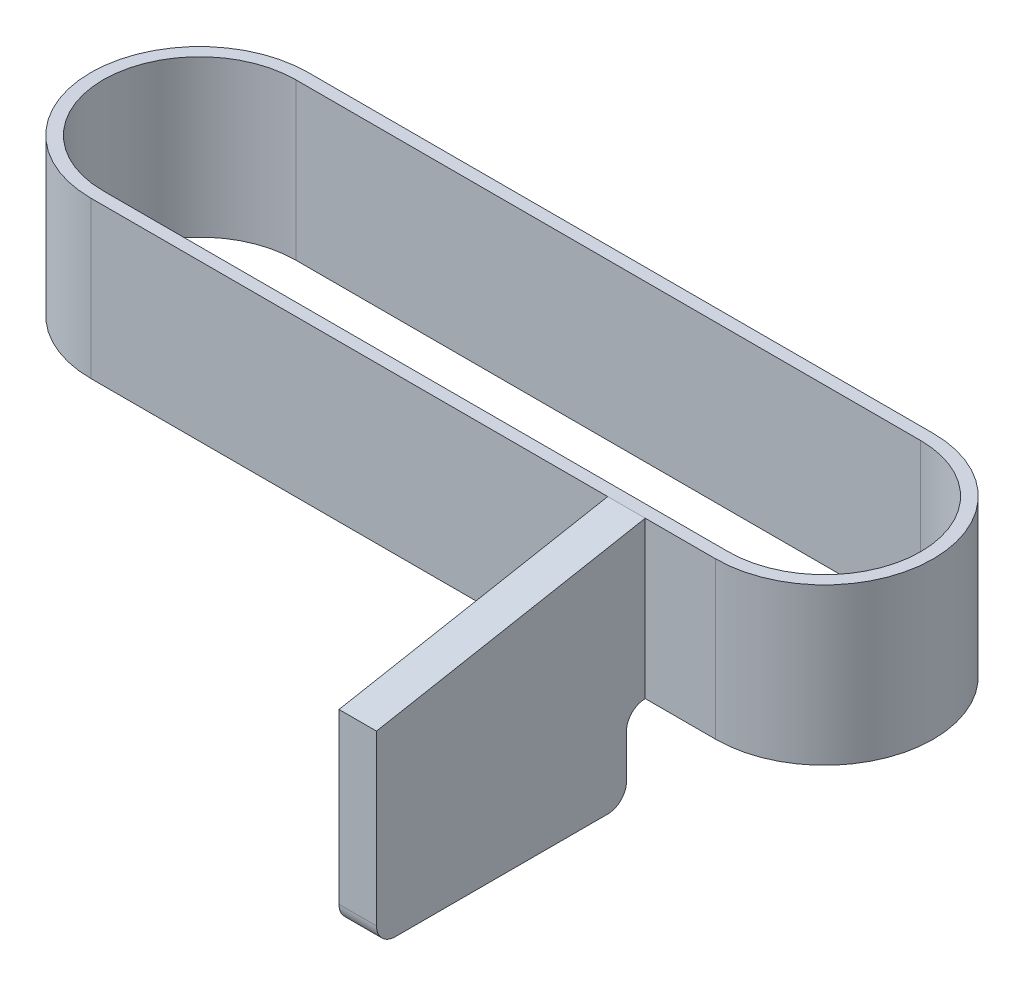
ISO-10303-21;
HEADER;
FILE_DESCRIPTION(('STEP AP214'),'2;1');
FILE_NAME('part.step','',(''),(''),'','','');
FILE_SCHEMA(('AUTOMOTIVE_DESIGN { 1 0 10303 214 1 1 1 1 }'));
ENDSEC;
DATA;
#1=APPLICATION_CONTEXT('core data for automotive mechanical design processes');
#2=APPLICATION_PROTOCOL_DEFINITION('international standard','automotive_design',2000,#1);
#3=PRODUCT_CONTEXT('',#1,'mechanical');
#4=PRODUCT('Part','Part','',(#3));
#5=PRODUCT_RELATED_PRODUCT_CATEGORY('part','',(#4));
#6=PRODUCT_DEFINITION_FORMATION('','',#4);
#7=PRODUCT_DEFINITION_CONTEXT('part definition',#1,'design');
#8=PRODUCT_DEFINITION('design','',#6,#7);
#9=PRODUCT_DEFINITION_SHAPE('','',#8);
#10=(LENGTH_UNIT() NAMED_UNIT(*) SI_UNIT(.MILLI.,.METRE.));
#11=(NAMED_UNIT(*) PLANE_ANGLE_UNIT() SI_UNIT($,.RADIAN.));
#12=(NAMED_UNIT(*) SI_UNIT($,.STERADIAN.) SOLID_ANGLE_UNIT());
#13=UNCERTAINTY_MEASURE_WITH_UNIT(LENGTH_MEASURE(1.E-05),#10,'distance_accuracy_value','');
#14=(GEOMETRIC_REPRESENTATION_CONTEXT(3) GLOBAL_UNCERTAINTY_ASSIGNED_CONTEXT((#13)) GLOBAL_UNIT_ASSIGNED_CONTEXT((#10,
#11,#12)) REPRESENTATION_CONTEXT('',''));
#15=CARTESIAN_POINT('',(0.,0.,0.));
#16=DIRECTION('',(0.,0.,1.));
#17=DIRECTION('',(1.,0.,0.));
#18=AXIS2_PLACEMENT_3D('',#15,#16,#17);
#19=CARTESIAN_POINT('',(-50.,12.5,17.4));
#20=DIRECTION('',(0.,0.,-1.));
#21=DIRECTION('',(-1.,0.,0.));
#22=AXIS2_PLACEMENT_3D('',#19,#20,#21);
#23=PLANE('',#22);
#24=DIRECTION('',(1.,0.,0.));
#25=VECTOR('',#24,1.);
#26=CARTESIAN_POINT('',(-50.,12.5,17.4));
#27=LINE('',#26,#25);
#28=CARTESIAN_POINT('',(38.717845515862,12.5,17.4));
#29=VERTEX_POINT('',#28);
#30=CARTESIAN_POINT('',(50.,12.5,17.4));
#31=VERTEX_POINT('',#30);
#32=EDGE_CURVE('E228',#29,#31,#27,.T.);
#33=ORIENTED_EDGE('',*,*,#32,.F.);
#34=DIRECTION('',(0.,-1.,0.));
#35=VECTOR('',#34,1.);
#36=CARTESIAN_POINT('',(38.717845515862,12.5,17.4));
#37=LINE('',#36,#35);
#38=CARTESIAN_POINT('',(38.717845515862,-12.5,17.4));
#39=VERTEX_POINT('',#38);
#40=EDGE_CURVE('E260',#29,#39,#37,.T.);
#41=ORIENTED_EDGE('',*,*,#40,.T.);
#42=DIRECTION('',(1.,0.,0.));
#43=VECTOR('',#42,1.);
#44=CARTESIAN_POINT('',(-50.,-12.5,17.4));
#45=LINE('',#44,#43);
#46=CARTESIAN_POINT('',(50.,-12.5,17.4));
#47=VERTEX_POINT('',#46);
#48=EDGE_CURVE('E240',#39,#47,#45,.T.);
#49=ORIENTED_EDGE('',*,*,#48,.T.);
#50=DIRECTION('',(0.,-1.,0.));
#51=VECTOR('',#50,1.);
#52=CARTESIAN_POINT('',(50.,12.5,17.4));
#53=LINE('',#52,#51);
#54=EDGE_CURVE('E252',#31,#47,#53,.T.);
#55=ORIENTED_EDGE('',*,*,#54,.F.);
#56=EDGE_LOOP('',(#33,#41,#49,#55));
#57=FACE_BOUND('',#56,.T.);
#58=ADVANCED_FACE('F41',(#57),#23,.F.);
#59=CARTESIAN_POINT('',(0.,-25.5,0.));
#60=DIRECTION('',(0.,1.,0.));
#61=DIRECTION('',(0.,0.,1.));
#62=AXIS2_PLACEMENT_3D('',#59,#60,#61);
#63=PLANE('',#62);
#64=DIRECTION('',(0.,0.,-1.));
#65=VECTOR('',#64,1.);
#66=CARTESIAN_POINT('',(38.717845515862,-25.5,60.4));
#67=LINE('',#66,#65);
#68=CARTESIAN_POINT('',(38.717845515862,-25.5,57.4));
#69=VERTEX_POINT('',#68);
#70=CARTESIAN_POINT('',(38.717845515862,-25.5,23.4));
#71=VERTEX_POINT('',#70);
#72=EDGE_CURVE('E188',#69,#71,#67,.T.);
#73=ORIENTED_EDGE('',*,*,#72,.F.);
#74=DIRECTION('',(1.,0.,0.));
#75=VECTOR('',#74,1.);
#76=CARTESIAN_POINT('',(32.7178455158621,-25.5,57.4));
#77=LINE('',#76,#75);
#78=CARTESIAN_POINT('',(32.717845515862,-25.5,57.4));
#79=VERTEX_POINT('',#78);
#80=EDGE_CURVE('E272',#69,#79,#77,.F.);
#81=ORIENTED_EDGE('',*,*,#80,.T.);
#82=DIRECTION('',(0.,0.,1.));
#83=VECTOR('',#82,1.);
#84=CARTESIAN_POINT('',(32.717845515862,-25.5,17.4));
#85=LINE('',#84,#83);
#86=CARTESIAN_POINT('',(32.717845515862,-25.5,23.4));
#87=VERTEX_POINT('',#86);
#88=EDGE_CURVE('E165',#87,#79,#85,.T.);
#89=ORIENTED_EDGE('',*,*,#88,.F.);
#90=DIRECTION('',(-1.,0.,0.));
#91=VECTOR('',#90,1.);
#92=CARTESIAN_POINT('',(38.717845515862,-25.5,23.4));
#93=LINE('',#92,#91);
#94=EDGE_CURVE('E270',#87,#71,#93,.F.);
#95=ORIENTED_EDGE('',*,*,#94,.T.);
#96=EDGE_LOOP('',(#73,#81,#89,#95));
#97=FACE_BOUND('',#96,.T.);
#98=ADVANCED_FACE('F303',(#97),#63,.F.);
#99=CARTESIAN_POINT('',(-50.,12.5,0.));
#100=DIRECTION('',(0.,1.,0.));
#101=DIRECTION('',(0.,0.,1.));
#102=AXIS2_PLACEMENT_3D('',#99,#100,#101);
#103=PLANE('',#102);
#104=CARTESIAN_POINT('',(-50.,12.5,17.4));
#105=VERTEX_POINT('',#104);
#106=CARTESIAN_POINT('',(32.717845515862,12.5,17.4));
#107=VERTEX_POINT('',#106);
#108=EDGE_CURVE('E230',#105,#107,#27,.T.);
#109=ORIENTED_EDGE('',*,*,#108,.T.);
#110=DIRECTION('',(-1.,0.,0.));
#111=VECTOR('',#110,1.);
#112=CARTESIAN_POINT('',(38.717845515862,12.5,17.4));
#113=LINE('',#112,#111);
#114=EDGE_CURVE('E175',#29,#107,#113,.T.);
#115=ORIENTED_EDGE('',*,*,#114,.F.);
#116=ORIENTED_EDGE('',*,*,#32,.T.);
#117=CARTESIAN_POINT('',(50.,12.5,0.));
#118=DIRECTION('',(0.,1.,0.));
#119=DIRECTION('',(0.,0.,1.));
#120=AXIS2_PLACEMENT_3D('',#117,#118,#119);
#121=CIRCLE('',#120,17.4);
#122=CARTESIAN_POINT('',(50.,12.5,-17.4));
#123=VERTEX_POINT('',#122);
#124=EDGE_CURVE('E233',#31,#123,#121,.T.);
#125=ORIENTED_EDGE('',*,*,#124,.T.);
#126=DIRECTION('',(-1.,0.,0.));
#127=VECTOR('',#126,1.);
#128=CARTESIAN_POINT('',(-50.,12.5,-17.4));
#129=LINE('',#128,#127);
#130=CARTESIAN_POINT('',(-50.,12.5,-17.4));
#131=VERTEX_POINT('',#130);
#132=EDGE_CURVE('E235',#123,#131,#129,.T.);
#133=ORIENTED_EDGE('',*,*,#132,.T.);
#134=CARTESIAN_POINT('',(-50.,12.5,0.));
#135=DIRECTION('',(0.,1.,0.));
#136=DIRECTION('',(0.,0.,1.));
#137=AXIS2_PLACEMENT_3D('',#134,#135,#136);
#138=CIRCLE('',#137,17.4);
#139=EDGE_CURVE('E225',#131,#105,#138,.T.);
#140=ORIENTED_EDGE('',*,*,#139,.T.);
#141=EDGE_LOOP('',(#109,#115,#116,#125,#133,#140));
#142=FACE_BOUND('',#141,.T.);
#143=DIRECTION('',(1.,0.,0.));
#144=VECTOR('',#143,1.);
#145=CARTESIAN_POINT('',(-50.,12.5,15.4));
#146=LINE('',#145,#144);
#147=CARTESIAN_POINT('',(-50.,12.5,15.4));
#148=VERTEX_POINT('',#147);
#149=CARTESIAN_POINT('',(50.,12.5,15.4));
#150=VERTEX_POINT('',#149);
#151=EDGE_CURVE('E196',#148,#150,#146,.T.);
#152=ORIENTED_EDGE('',*,*,#151,.F.);
#153=CARTESIAN_POINT('',(-50.,12.5,0.));
#154=DIRECTION('',(0.,1.,0.));
#155=DIRECTION('',(0.,0.,1.));
#156=AXIS2_PLACEMENT_3D('',#153,#154,#155);
#157=CIRCLE('',#156,15.4);
#158=CARTESIAN_POINT('',(-50.,12.5,-15.4));
#159=VERTEX_POINT('',#158);
#160=EDGE_CURVE('E194',#159,#148,#157,.T.);
#161=ORIENTED_EDGE('',*,*,#160,.F.);
#162=DIRECTION('',(-1.,0.,0.));
#163=VECTOR('',#162,1.);
#164=CARTESIAN_POINT('',(-50.,12.5,-15.4));
#165=LINE('',#164,#163);
#166=CARTESIAN_POINT('',(50.,12.5,-15.4));
#167=VERTEX_POINT('',#166);
#168=EDGE_CURVE('E202',#167,#159,#165,.T.);
#169=ORIENTED_EDGE('',*,*,#168,.F.);
#170=CARTESIAN_POINT('',(50.,12.5,0.));
#171=DIRECTION('',(0.,1.,0.));
#172=DIRECTION('',(0.,0.,1.));
#173=AXIS2_PLACEMENT_3D('',#170,#171,#172);
#174=CIRCLE('',#173,15.4);
#175=EDGE_CURVE('E199',#150,#167,#174,.T.);
#176=ORIENTED_EDGE('',*,*,#175,.F.);
#177=EDGE_LOOP('',(#152,#161,#169,#176));
#178=FACE_BOUND('',#177,.T.);
#179=ADVANCED_FACE('F325',(#142,#178),#103,.T.);
#180=CARTESIAN_POINT('',(-50.,-12.5,0.));
#181=DIRECTION('',(0.,1.,0.));
#182=DIRECTION('',(0.,0.,1.));
#183=AXIS2_PLACEMENT_3D('',#180,#181,#182);
#184=PLANE('',#183);
#185=ORIENTED_EDGE('',*,*,#48,.F.);
#186=DIRECTION('',(1.,0.,0.));
#187=VECTOR('',#186,1.);
#188=CARTESIAN_POINT('',(-50.,-12.5,17.4));
#189=LINE('',#188,#187);
#190=CARTESIAN_POINT('',(32.717845515862,-12.5,17.4));
#191=VERTEX_POINT('',#190);
#192=EDGE_CURVE('E282',#39,#191,#189,.F.);
#193=ORIENTED_EDGE('',*,*,#192,.T.);
#194=CARTESIAN_POINT('',(-50.,-12.5,17.4));
#195=VERTEX_POINT('',#194);
#196=EDGE_CURVE('E241',#195,#191,#45,.T.);
#197=ORIENTED_EDGE('',*,*,#196,.F.);
#198=CARTESIAN_POINT('',(-50.,-12.5,0.));
#199=DIRECTION('',(0.,1.,0.));
#200=DIRECTION('',(0.,0.,1.));
#201=AXIS2_PLACEMENT_3D('',#198,#199,#200);
#202=CIRCLE('',#201,17.4);
#203=CARTESIAN_POINT('',(-50.,-12.5,-17.4));
#204=VERTEX_POINT('',#203);
#205=EDGE_CURVE('E224',#204,#195,#202,.T.);
#206=ORIENTED_EDGE('',*,*,#205,.F.);
#207=DIRECTION('',(-1.,0.,0.));
#208=VECTOR('',#207,1.);
#209=CARTESIAN_POINT('',(-50.,-12.5,-17.4));
#210=LINE('',#209,#208);
#211=CARTESIAN_POINT('',(50.,-12.5,-17.4));
#212=VERTEX_POINT('',#211);
#213=EDGE_CURVE('E229',#212,#204,#210,.T.);
#214=ORIENTED_EDGE('',*,*,#213,.F.);
#215=CARTESIAN_POINT('',(50.,-12.5,0.));
#216=DIRECTION('',(0.,1.,0.));
#217=DIRECTION('',(0.,0.,1.));
#218=AXIS2_PLACEMENT_3D('',#215,#216,#217);
#219=CIRCLE('',#218,17.4);
#220=EDGE_CURVE('E244',#47,#212,#219,.T.);
#221=ORIENTED_EDGE('',*,*,#220,.F.);
#222=EDGE_LOOP('',(#185,#193,#197,#206,#214,#221));
#223=FACE_BOUND('',#222,.T.);
#224=CARTESIAN_POINT('',(-50.,-12.5,0.));
#225=DIRECTION('',(0.,1.,0.));
#226=DIRECTION('',(0.,0.,1.));
#227=AXIS2_PLACEMENT_3D('',#224,#225,#226);
#228=CIRCLE('',#227,15.4);
#229=CARTESIAN_POINT('',(-50.,-12.5,-15.4));
#230=VERTEX_POINT('',#229);
#231=CARTESIAN_POINT('',(-50.,-12.5,15.4));
#232=VERTEX_POINT('',#231);
#233=EDGE_CURVE('E192',#230,#232,#228,.T.);
#234=ORIENTED_EDGE('',*,*,#233,.T.);
#235=DIRECTION('',(1.,0.,0.));
#236=VECTOR('',#235,1.);
#237=CARTESIAN_POINT('',(-50.,-12.5,15.4));
#238=LINE('',#237,#236);
#239=CARTESIAN_POINT('',(50.,-12.5,15.4));
#240=VERTEX_POINT('',#239);
#241=EDGE_CURVE('E207',#232,#240,#238,.T.);
#242=ORIENTED_EDGE('',*,*,#241,.T.);
#243=CARTESIAN_POINT('',(50.,-12.5,0.));
#244=DIRECTION('',(0.,1.,0.));
#245=DIRECTION('',(0.,0.,1.));
#246=AXIS2_PLACEMENT_3D('',#243,#244,#245);
#247=CIRCLE('',#246,15.4);
#248=CARTESIAN_POINT('',(50.,-12.5,-15.4));
#249=VERTEX_POINT('',#248);
#250=EDGE_CURVE('E210',#240,#249,#247,.T.);
#251=ORIENTED_EDGE('',*,*,#250,.T.);
#252=DIRECTION('',(-1.,0.,0.));
#253=VECTOR('',#252,1.);
#254=CARTESIAN_POINT('',(-50.,-12.5,-15.4));
#255=LINE('',#254,#253);
#256=EDGE_CURVE('E197',#249,#230,#255,.T.);
#257=ORIENTED_EDGE('',*,*,#256,.T.);
#258=EDGE_LOOP('',(#234,#242,#251,#257));
#259=FACE_BOUND('',#258,.T.);
#260=ADVANCED_FACE('F292',(#223,#259),#184,.F.);
#261=CARTESIAN_POINT('',(-50.,12.5,0.));
#262=DIRECTION('',(0.,-1.,0.));
#263=DIRECTION('',(0.,0.,-1.));
#264=AXIS2_PLACEMENT_3D('',#261,#262,#263);
#265=CYLINDRICAL_SURFACE('',#264,17.4);
#266=ORIENTED_EDGE('',*,*,#205,.T.);
#267=DIRECTION('',(0.,-1.,0.));
#268=VECTOR('',#267,1.);
#269=CARTESIAN_POINT('',(-50.,12.5,17.4));
#270=LINE('',#269,#268);
#271=EDGE_CURVE('E255',#105,#195,#270,.T.);
#272=ORIENTED_EDGE('',*,*,#271,.F.);
#273=ORIENTED_EDGE('',*,*,#139,.F.);
#274=DIRECTION('',(0.,-1.,0.));
#275=VECTOR('',#274,1.);
#276=CARTESIAN_POINT('',(-50.,12.5,-17.4));
#277=LINE('',#276,#275);
#278=EDGE_CURVE('E237',#131,#204,#277,.T.);
#279=ORIENTED_EDGE('',*,*,#278,.T.);
#280=EDGE_LOOP('',(#266,#272,#273,#279));
#281=FACE_BOUND('',#280,.T.);
#282=ADVANCED_FACE('F330',(#281),#265,.T.);
#283=DIRECTION('',(0.,1.,0.));
#284=VECTOR('',#283,1.);
#285=CARTESIAN_POINT('',(32.717845515862,12.5,17.4));
#286=LINE('',#285,#284);
#287=EDGE_CURVE('E258',#191,#107,#286,.T.);
#288=ORIENTED_EDGE('',*,*,#287,.T.);
#289=ORIENTED_EDGE('',*,*,#108,.F.);
#290=ORIENTED_EDGE('',*,*,#271,.T.);
#291=ORIENTED_EDGE('',*,*,#196,.T.);
#292=EDGE_LOOP('',(#288,#289,#290,#291));
#293=FACE_BOUND('',#292,.T.);
#294=ADVANCED_FACE('F320',(#293),#23,.F.);
#295=CARTESIAN_POINT('',(50.,12.5,0.));
#296=DIRECTION('',(0.,-1.,0.));
#297=DIRECTION('',(0.,0.,-1.));
#298=AXIS2_PLACEMENT_3D('',#295,#296,#297);
#299=CYLINDRICAL_SURFACE('',#298,17.4);
#300=ORIENTED_EDGE('',*,*,#220,.T.);
#301=DIRECTION('',(0.,-1.,0.));
#302=VECTOR('',#301,1.);
#303=CARTESIAN_POINT('',(50.,12.5,-17.4));
#304=LINE('',#303,#302);
#305=EDGE_CURVE('E249',#123,#212,#304,.T.);
#306=ORIENTED_EDGE('',*,*,#305,.F.);
#307=ORIENTED_EDGE('',*,*,#124,.F.);
#308=ORIENTED_EDGE('',*,*,#54,.T.);
#309=EDGE_LOOP('',(#300,#306,#307,#308));
#310=FACE_BOUND('',#309,.T.);
#311=ADVANCED_FACE('F329',(#310),#299,.T.);
#312=CARTESIAN_POINT('',(-50.,12.5,-17.4));
#313=DIRECTION('',(0.,0.,1.));
#314=DIRECTION('',(1.,0.,0.));
#315=AXIS2_PLACEMENT_3D('',#312,#313,#314);
#316=PLANE('',#315);
#317=ORIENTED_EDGE('',*,*,#213,.T.);
#318=ORIENTED_EDGE('',*,*,#278,.F.);
#319=ORIENTED_EDGE('',*,*,#132,.F.);
#320=ORIENTED_EDGE('',*,*,#305,.T.);
#321=EDGE_LOOP('',(#317,#318,#319,#320));
#322=FACE_BOUND('',#321,.T.);
#323=ADVANCED_FACE('F336',(#322),#316,.F.);
#324=CARTESIAN_POINT('',(-50.,12.5,0.));
#325=DIRECTION('',(0.,-1.,0.));
#326=DIRECTION('',(0.,0.,-1.));
#327=AXIS2_PLACEMENT_3D('',#324,#325,#326);
#328=CYLINDRICAL_SURFACE('',#327,15.4);
#329=ORIENTED_EDGE('',*,*,#233,.F.);
#330=DIRECTION('',(0.,-1.,0.));
#331=VECTOR('',#330,1.);
#332=CARTESIAN_POINT('',(-50.,12.5,-15.4));
#333=LINE('',#332,#331);
#334=EDGE_CURVE('E204',#159,#230,#333,.T.);
#335=ORIENTED_EDGE('',*,*,#334,.F.);
#336=ORIENTED_EDGE('',*,*,#160,.T.);
#337=DIRECTION('',(0.,-1.,0.));
#338=VECTOR('',#337,1.);
#339=CARTESIAN_POINT('',(-50.,12.5,15.4));
#340=LINE('',#339,#338);
#341=EDGE_CURVE('E221',#148,#232,#340,.T.);
#342=ORIENTED_EDGE('',*,*,#341,.T.);
#343=EDGE_LOOP('',(#329,#335,#336,#342));
#344=FACE_BOUND('',#343,.T.);
#345=ADVANCED_FACE('F351',(#344),#328,.F.);
#346=CARTESIAN_POINT('',(-50.,12.5,15.4));
#347=DIRECTION('',(0.,0.,-1.));
#348=DIRECTION('',(-1.,0.,0.));
#349=AXIS2_PLACEMENT_3D('',#346,#347,#348);
#350=PLANE('',#349);
#351=ORIENTED_EDGE('',*,*,#241,.F.);
#352=ORIENTED_EDGE('',*,*,#341,.F.);
#353=ORIENTED_EDGE('',*,*,#151,.T.);
#354=DIRECTION('',(0.,-1.,0.));
#355=VECTOR('',#354,1.);
#356=CARTESIAN_POINT('',(50.,12.5,15.4));
#357=LINE('',#356,#355);
#358=EDGE_CURVE('E219',#150,#240,#357,.T.);
#359=ORIENTED_EDGE('',*,*,#358,.T.);
#360=EDGE_LOOP('',(#351,#352,#353,#359));
#361=FACE_BOUND('',#360,.T.);
#362=ADVANCED_FACE('F356',(#361),#350,.T.);
#363=CARTESIAN_POINT('',(50.,12.5,0.));
#364=DIRECTION('',(0.,-1.,0.));
#365=DIRECTION('',(0.,0.,-1.));
#366=AXIS2_PLACEMENT_3D('',#363,#364,#365);
#367=CYLINDRICAL_SURFACE('',#366,15.4);
#368=ORIENTED_EDGE('',*,*,#250,.F.);
#369=ORIENTED_EDGE('',*,*,#358,.F.);
#370=ORIENTED_EDGE('',*,*,#175,.T.);
#371=DIRECTION('',(0.,-1.,0.));
#372=VECTOR('',#371,1.);
#373=CARTESIAN_POINT('',(50.,12.5,-15.4));
#374=LINE('',#373,#372);
#375=EDGE_CURVE('E217',#167,#249,#374,.T.);
#376=ORIENTED_EDGE('',*,*,#375,.T.);
#377=EDGE_LOOP('',(#368,#369,#370,#376));
#378=FACE_BOUND('',#377,.T.);
#379=ADVANCED_FACE('F365',(#378),#367,.F.);
#380=CARTESIAN_POINT('',(-50.,12.5,-15.4));
#381=DIRECTION('',(0.,0.,1.));
#382=DIRECTION('',(1.,0.,0.));
#383=AXIS2_PLACEMENT_3D('',#380,#381,#382);
#384=PLANE('',#383);
#385=ORIENTED_EDGE('',*,*,#256,.F.);
#386=ORIENTED_EDGE('',*,*,#375,.F.);
#387=ORIENTED_EDGE('',*,*,#168,.T.);
#388=ORIENTED_EDGE('',*,*,#334,.T.);
#389=EDGE_LOOP('',(#385,#386,#387,#388));
#390=FACE_BOUND('',#389,.T.);
#391=ADVANCED_FACE('F369',(#390),#384,.T.);
#392=CARTESIAN_POINT('',(38.717845515862,-25.5,60.4));
#393=DIRECTION('',(1.,0.,0.));
#394=DIRECTION('',(0.,0.,-1.));
#395=AXIS2_PLACEMENT_3D('',#392,#393,#394);
#396=PLANE('',#395);
#397=DIRECTION('',(0.,1.,0.));
#398=VECTOR('',#397,1.);
#399=CARTESIAN_POINT('',(38.717845515862,-25.5,60.4));
#400=LINE('',#399,#398);
#401=CARTESIAN_POINT('',(38.717845515862,-22.5,60.4));
#402=VERTEX_POINT('',#401);
#403=CARTESIAN_POINT('',(38.717845515862,4.5,60.4));
#404=VERTEX_POINT('',#403);
#405=EDGE_CURVE('E164',#402,#404,#400,.T.);
#406=ORIENTED_EDGE('',*,*,#405,.F.);
#407=CARTESIAN_POINT('',(38.717845515862,-22.5,57.4));
#408=DIRECTION('',(1.,0.,0.));
#409=DIRECTION('',(0.,0.,-1.));
#410=AXIS2_PLACEMENT_3D('',#407,#408,#409);
#411=CIRCLE('',#410,3.);
#412=EDGE_CURVE('E268',#402,#69,#411,.T.);
#413=ORIENTED_EDGE('',*,*,#412,.T.);
#414=ORIENTED_EDGE('',*,*,#72,.T.);
#415=CARTESIAN_POINT('',(38.717845515862,-22.5,23.4));
#416=DIRECTION('',(1.,0.,0.));
#417=DIRECTION('',(0.,0.,-1.));
#418=AXIS2_PLACEMENT_3D('',#415,#416,#417);
#419=CIRCLE('',#418,3.);
#420=CARTESIAN_POINT('',(38.717845515862,-22.5,20.4));
#421=VERTEX_POINT('',#420);
#422=EDGE_CURVE('E265',#71,#421,#419,.T.);
#423=ORIENTED_EDGE('',*,*,#422,.T.);
#424=DIRECTION('',(0.,-1.,0.));
#425=VECTOR('',#424,1.);
#426=CARTESIAN_POINT('',(38.717845515862,-12.5,20.4));
#427=LINE('',#426,#425);
#428=CARTESIAN_POINT('',(38.717845515862,-15.5,20.4));
#429=VERTEX_POINT('',#428);
#430=EDGE_CURVE('E174',#429,#421,#427,.T.);
#431=ORIENTED_EDGE('',*,*,#430,.F.);
#432=CARTESIAN_POINT('',(38.717845515862,-15.5,17.4));
#433=DIRECTION('',(1.,0.,0.));
#434=DIRECTION('',(0.,0.,-1.));
#435=AXIS2_PLACEMENT_3D('',#432,#433,#434);
#436=CIRCLE('',#435,3.);
#437=EDGE_CURVE('E49',#429,#39,#436,.F.);
#438=ORIENTED_EDGE('',*,*,#437,.T.);
#439=ORIENTED_EDGE('',*,*,#40,.F.);
#440=DIRECTION('',(0.,0.182907916182992,-0.983130049483585));
#441=VECTOR('',#440,1.);
#442=CARTESIAN_POINT('',(38.717845515862,4.5,60.4));
#443=LINE('',#442,#441);
#444=EDGE_CURVE('E180',#404,#29,#443,.T.);
#445=ORIENTED_EDGE('',*,*,#444,.F.);
#446=EDGE_LOOP('',(#406,#413,#414,#423,#431,#438,#439,#445));
#447=FACE_BOUND('',#446,.T.);
#448=ADVANCED_FACE('F285',(#447),#396,.T.);
#449=CARTESIAN_POINT('',(32.717845515862,-25.5,60.4));
#450=DIRECTION('',(0.,0.,1.));
#451=DIRECTION('',(1.,0.,0.));
#452=AXIS2_PLACEMENT_3D('',#449,#450,#451);
#453=PLANE('',#452);
#454=DIRECTION('',(0.,1.,0.));
#455=VECTOR('',#454,1.);
#456=CARTESIAN_POINT('',(32.717845515862,-25.5,60.4));
#457=LINE('',#456,#455);
#458=CARTESIAN_POINT('',(32.717845515862,-22.5,60.4));
#459=VERTEX_POINT('',#458);
#460=CARTESIAN_POINT('',(32.717845515862,4.5,60.4));
#461=VERTEX_POINT('',#460);
#462=EDGE_CURVE('E153',#459,#461,#457,.T.);
#463=ORIENTED_EDGE('',*,*,#462,.F.);
#464=DIRECTION('',(1.,0.,0.));
#465=VECTOR('',#464,1.);
#466=CARTESIAN_POINT('',(38.717845515862,-22.5,60.4));
#467=LINE('',#466,#465);
#468=EDGE_CURVE('E263',#459,#402,#467,.T.);
#469=ORIENTED_EDGE('',*,*,#468,.T.);
#470=ORIENTED_EDGE('',*,*,#405,.T.);
#471=DIRECTION('',(1.,0.,0.));
#472=VECTOR('',#471,1.);
#473=CARTESIAN_POINT('',(38.717845515862,4.5,60.4));
#474=LINE('',#473,#472);
#475=EDGE_CURVE('E168',#461,#404,#474,.T.);
#476=ORIENTED_EDGE('',*,*,#475,.F.);
#477=EDGE_LOOP('',(#463,#469,#470,#476));
#478=FACE_BOUND('',#477,.T.);
#479=ADVANCED_FACE('F169',(#478),#453,.T.);
#480=CARTESIAN_POINT('',(32.717845515862,-25.5,17.4));
#481=DIRECTION('',(-1.,0.,0.));
#482=DIRECTION('',(0.,0.,1.));
#483=AXIS2_PLACEMENT_3D('',#480,#481,#482);
#484=PLANE('',#483);
#485=ORIENTED_EDGE('',*,*,#88,.T.);
#486=CARTESIAN_POINT('',(32.717845515862,-22.5,57.4));
#487=DIRECTION('',(-1.,0.,0.));
#488=DIRECTION('',(0.,0.,1.));
#489=AXIS2_PLACEMENT_3D('',#486,#487,#488);
#490=CIRCLE('',#489,3.);
#491=EDGE_CURVE('E160',#79,#459,#490,.T.);
#492=ORIENTED_EDGE('',*,*,#491,.T.);
#493=ORIENTED_EDGE('',*,*,#462,.T.);
#494=DIRECTION('',(0.,0.182907916182992,-0.983130049483585));
#495=VECTOR('',#494,1.);
#496=CARTESIAN_POINT('',(32.717845515862,4.5,60.4));
#497=LINE('',#496,#495);
#498=EDGE_CURVE('E158',#461,#107,#497,.T.);
#499=ORIENTED_EDGE('',*,*,#498,.T.);
#500=ORIENTED_EDGE('',*,*,#287,.F.);
#501=CARTESIAN_POINT('',(32.717845515862,-15.5,17.4));
#502=DIRECTION('',(-1.,0.,0.));
#503=DIRECTION('',(0.,0.,1.));
#504=AXIS2_PLACEMENT_3D('',#501,#502,#503);
#505=CIRCLE('',#504,3.);
#506=CARTESIAN_POINT('',(32.717845515862,-15.5,20.4));
#507=VERTEX_POINT('',#506);
#508=EDGE_CURVE('E11',#191,#507,#505,.F.);
#509=ORIENTED_EDGE('',*,*,#508,.T.);
#510=DIRECTION('',(0.,1.,0.));
#511=VECTOR('',#510,1.);
#512=CARTESIAN_POINT('',(32.717845515862,-12.5,20.4));
#513=LINE('',#512,#511);
#514=CARTESIAN_POINT('',(32.717845515862,-22.5,20.4));
#515=VERTEX_POINT('',#514);
#516=EDGE_CURVE('E186',#515,#507,#513,.T.);
#517=ORIENTED_EDGE('',*,*,#516,.F.);
#518=CARTESIAN_POINT('',(32.717845515862,-22.5,23.4));
#519=DIRECTION('',(-1.,0.,0.));
#520=DIRECTION('',(0.,0.,1.));
#521=AXIS2_PLACEMENT_3D('',#518,#519,#520);
#522=CIRCLE('',#521,3.);
#523=EDGE_CURVE('E274',#515,#87,#522,.T.);
#524=ORIENTED_EDGE('',*,*,#523,.T.);
#525=EDGE_LOOP('',(#485,#492,#493,#499,#500,#509,#517,#524));
#526=FACE_BOUND('',#525,.T.);
#527=ADVANCED_FACE('F156',(#526),#484,.T.);
#528=CARTESIAN_POINT('',(0.,0.,20.4));
#529=DIRECTION('',(0.,0.,-1.));
#530=DIRECTION('',(-1.,0.,0.));
#531=AXIS2_PLACEMENT_3D('',#528,#529,#530);
#532=PLANE('',#531);
#533=ORIENTED_EDGE('',*,*,#516,.T.);
#534=DIRECTION('',(1.,0.,0.));
#535=VECTOR('',#534,1.);
#536=CARTESIAN_POINT('',(0.,-15.5,20.4));
#537=LINE('',#536,#535);
#538=EDGE_CURVE('E280',#507,#429,#537,.T.);
#539=ORIENTED_EDGE('',*,*,#538,.T.);
#540=ORIENTED_EDGE('',*,*,#430,.T.);
#541=DIRECTION('',(-1.,0.,0.));
#542=VECTOR('',#541,1.);
#543=CARTESIAN_POINT('',(32.717845515862,-22.5,20.4));
#544=LINE('',#543,#542);
#545=EDGE_CURVE('E277',#421,#515,#544,.T.);
#546=ORIENTED_EDGE('',*,*,#545,.T.);
#547=EDGE_LOOP('',(#533,#539,#540,#546));
#548=FACE_BOUND('',#547,.T.);
#549=ADVANCED_FACE('F296',(#548),#532,.T.);
#550=CARTESIAN_POINT('',(38.717845515862,4.5,60.4));
#551=DIRECTION('',(0.,0.983130049483584,0.182907916182992));
#552=DIRECTION('',(0.,-0.182907916182992,0.983130049483585));
#553=AXIS2_PLACEMENT_3D('',#550,#551,#552);
#554=PLANE('',#553);
#555=ORIENTED_EDGE('',*,*,#498,.F.);
#556=ORIENTED_EDGE('',*,*,#475,.T.);
#557=ORIENTED_EDGE('',*,*,#444,.T.);
#558=ORIENTED_EDGE('',*,*,#114,.T.);
#559=EDGE_LOOP('',(#555,#556,#557,#558));
#560=FACE_BOUND('',#559,.T.);
#561=ADVANCED_FACE('F178',(#560),#554,.T.);
#562=CARTESIAN_POINT('',(32.717845515862,-22.5,57.4));
#563=DIRECTION('',(-1.,0.,0.));
#564=DIRECTION('',(0.,0.,1.));
#565=AXIS2_PLACEMENT_3D('',#562,#563,#564);
#566=CYLINDRICAL_SURFACE('',#565,3.);
#567=ORIENTED_EDGE('',*,*,#491,.F.);
#568=ORIENTED_EDGE('',*,*,#80,.F.);
#569=ORIENTED_EDGE('',*,*,#412,.F.);
#570=ORIENTED_EDGE('',*,*,#468,.F.);
#571=EDGE_LOOP('',(#567,#568,#569,#570));
#572=FACE_BOUND('',#571,.T.);
#573=ADVANCED_FACE('F308',(#572),#566,.T.);
#574=CARTESIAN_POINT('',(0.,-22.5,23.4));
#575=DIRECTION('',(1.,0.,0.));
#576=DIRECTION('',(0.,0.,-1.));
#577=AXIS2_PLACEMENT_3D('',#574,#575,#576);
#578=CYLINDRICAL_SURFACE('',#577,3.);
#579=ORIENTED_EDGE('',*,*,#422,.F.);
#580=ORIENTED_EDGE('',*,*,#94,.F.);
#581=ORIENTED_EDGE('',*,*,#523,.F.);
#582=ORIENTED_EDGE('',*,*,#545,.F.);
#583=EDGE_LOOP('',(#579,#580,#581,#582));
#584=FACE_BOUND('',#583,.T.);
#585=ADVANCED_FACE('F306',(#584),#578,.T.);
#586=CARTESIAN_POINT('',(0.,-15.5,17.4));
#587=DIRECTION('',(1.,0.,0.));
#588=DIRECTION('',(0.,0.,-1.));
#589=AXIS2_PLACEMENT_3D('',#586,#587,#588);
#590=CYLINDRICAL_SURFACE('',#589,3.);
#591=ORIENTED_EDGE('',*,*,#508,.F.);
#592=ORIENTED_EDGE('',*,*,#192,.F.);
#593=ORIENTED_EDGE('',*,*,#437,.F.);
#594=ORIENTED_EDGE('',*,*,#538,.F.);
#595=EDGE_LOOP('',(#591,#592,#593,#594));
#596=FACE_BOUND('',#595,.T.);
#597=ADVANCED_FACE('F43',(#596),#590,.F.);
#598=CLOSED_SHELL('',(#58,#98,#179,#260,#282,#294,#311,#323,#345,#362,#379,#391,#448,#479,#527,
#549,#561,#573,#585,#597));
#599=MANIFOLD_SOLID_BREP('B2',#598);
#600=ADVANCED_BREP_SHAPE_REPRESENTATION('',(#18,#599),#14);
#601=SHAPE_DEFINITION_REPRESENTATION(#9,#600);
ENDSEC;
END-ISO-10303-21;
